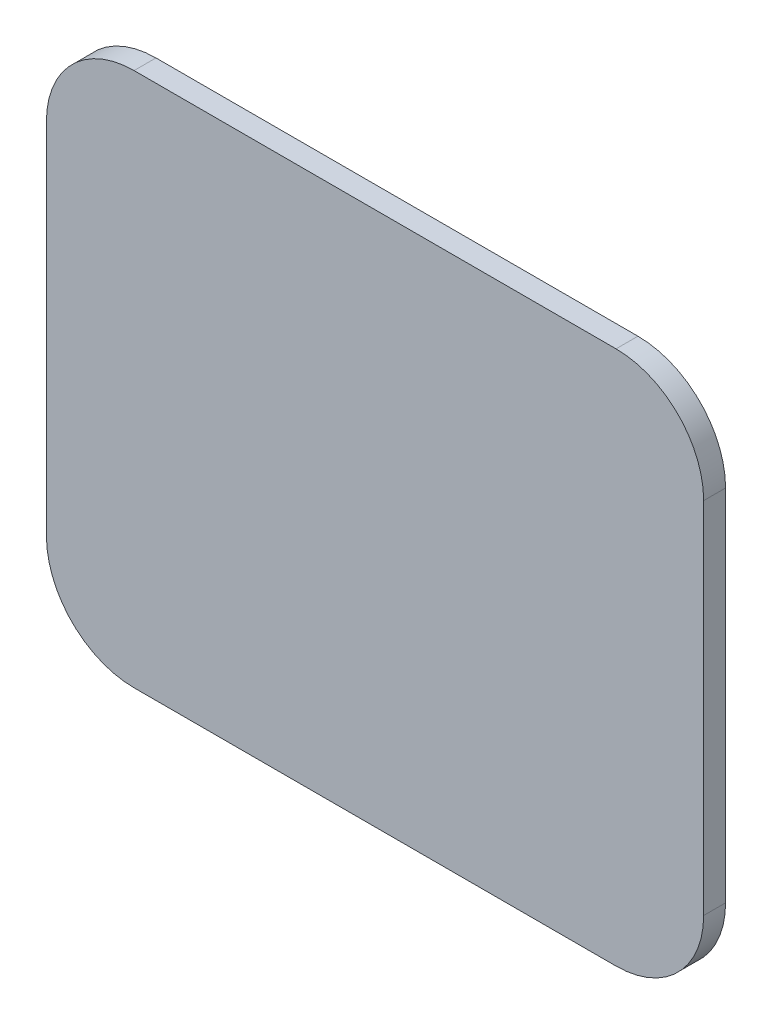
ISO-10303-21;
HEADER;
FILE_DESCRIPTION(('STEP AP214'),'2;1');
FILE_NAME('part.step','',(''),(''),'','','');
FILE_SCHEMA(('AUTOMOTIVE_DESIGN { 1 0 10303 214 1 1 1 1 }'));
ENDSEC;
DATA;
#1=APPLICATION_CONTEXT('core data for automotive mechanical design processes');
#2=APPLICATION_PROTOCOL_DEFINITION('international standard','automotive_design',2000,#1);
#3=PRODUCT_CONTEXT('',#1,'mechanical');
#4=PRODUCT('Part','Part','',(#3));
#5=PRODUCT_RELATED_PRODUCT_CATEGORY('part','',(#4));
#6=PRODUCT_DEFINITION_FORMATION('','',#4);
#7=PRODUCT_DEFINITION_CONTEXT('part definition',#1,'design');
#8=PRODUCT_DEFINITION('design','',#6,#7);
#9=PRODUCT_DEFINITION_SHAPE('','',#8);
#10=(LENGTH_UNIT() NAMED_UNIT(*) SI_UNIT(.MILLI.,.METRE.));
#11=(NAMED_UNIT(*) PLANE_ANGLE_UNIT() SI_UNIT($,.RADIAN.));
#12=(NAMED_UNIT(*) SI_UNIT($,.STERADIAN.) SOLID_ANGLE_UNIT());
#13=UNCERTAINTY_MEASURE_WITH_UNIT(LENGTH_MEASURE(1.E-05),#10,'distance_accuracy_value','');
#14=(GEOMETRIC_REPRESENTATION_CONTEXT(3) GLOBAL_UNCERTAINTY_ASSIGNED_CONTEXT((#13)) GLOBAL_UNIT_ASSIGNED_CONTEXT((#10,
#11,#12)) REPRESENTATION_CONTEXT('',''));
#15=CARTESIAN_POINT('',(0.,0.,0.));
#16=DIRECTION('',(0.,0.,1.));
#17=DIRECTION('',(1.,0.,0.));
#18=AXIS2_PLACEMENT_3D('',#15,#16,#17);
#19=CARTESIAN_POINT('',(55.,41.,5.));
#20=DIRECTION('',(0.,0.,-1.));
#21=DIRECTION('',(-1.,0.,0.));
#22=AXIS2_PLACEMENT_3D('',#19,#20,#21);
#23=CYLINDRICAL_SURFACE('',#22,20.);
#24=CARTESIAN_POINT('',(55.,41.,0.));
#25=DIRECTION('',(0.,0.,1.));
#26=DIRECTION('',(-1.,0.,0.));
#27=AXIS2_PLACEMENT_3D('',#24,#25,#26);
#28=CIRCLE('',#27,20.);
#29=CARTESIAN_POINT('',(75.,41.,0.));
#30=VERTEX_POINT('',#29);
#31=CARTESIAN_POINT('',(55.,61.,0.));
#32=VERTEX_POINT('',#31);
#33=EDGE_CURVE('E146',#30,#32,#28,.T.);
#34=ORIENTED_EDGE('',*,*,#33,.T.);
#35=DIRECTION('',(0.,0.,-1.));
#36=VECTOR('',#35,1.);
#37=CARTESIAN_POINT('',(55.,61.,5.));
#38=LINE('',#37,#36);
#39=CARTESIAN_POINT('',(55.,61.,5.));
#40=VERTEX_POINT('',#39);
#41=EDGE_CURVE('E11',#40,#32,#38,.T.);
#42=ORIENTED_EDGE('',*,*,#41,.F.);
#43=CARTESIAN_POINT('',(55.,41.,5.));
#44=DIRECTION('',(0.,0.,1.));
#45=DIRECTION('',(-1.,0.,0.));
#46=AXIS2_PLACEMENT_3D('',#43,#44,#45);
#47=CIRCLE('',#46,20.);
#48=CARTESIAN_POINT('',(75.,41.,5.));
#49=VERTEX_POINT('',#48);
#50=EDGE_CURVE('E168',#49,#40,#47,.T.);
#51=ORIENTED_EDGE('',*,*,#50,.F.);
#52=DIRECTION('',(0.,0.,-1.));
#53=VECTOR('',#52,1.);
#54=CARTESIAN_POINT('',(75.,41.,5.));
#55=LINE('',#54,#53);
#56=EDGE_CURVE('E142',#49,#30,#55,.T.);
#57=ORIENTED_EDGE('',*,*,#56,.T.);
#58=EDGE_LOOP('',(#34,#42,#51,#57));
#59=FACE_BOUND('',#58,.T.);
#60=ADVANCED_FACE('F45',(#59),#23,.T.);
#61=CARTESIAN_POINT('',(-55.,61.,5.));
#62=DIRECTION('',(0.,-1.,0.));
#63=DIRECTION('',(0.,0.,-1.));
#64=AXIS2_PLACEMENT_3D('',#61,#62,#63);
#65=PLANE('',#64);
#66=DIRECTION('',(-1.,0.,0.));
#67=VECTOR('',#66,1.);
#68=CARTESIAN_POINT('',(-55.,61.,0.));
#69=LINE('',#68,#67);
#70=CARTESIAN_POINT('',(-55.,61.,0.));
#71=VERTEX_POINT('',#70);
#72=EDGE_CURVE('E150',#32,#71,#69,.T.);
#73=ORIENTED_EDGE('',*,*,#72,.T.);
#74=DIRECTION('',(0.,0.,-1.));
#75=VECTOR('',#74,1.);
#76=CARTESIAN_POINT('',(-55.,61.,5.));
#77=LINE('',#76,#75);
#78=CARTESIAN_POINT('',(-55.,61.,5.));
#79=VERTEX_POINT('',#78);
#80=EDGE_CURVE('E54',#79,#71,#77,.T.);
#81=ORIENTED_EDGE('',*,*,#80,.F.);
#82=DIRECTION('',(-1.,0.,0.));
#83=VECTOR('',#82,1.);
#84=CARTESIAN_POINT('',(-55.,61.,5.));
#85=LINE('',#84,#83);
#86=EDGE_CURVE('E105',#40,#79,#85,.T.);
#87=ORIENTED_EDGE('',*,*,#86,.F.);
#88=ORIENTED_EDGE('',*,*,#41,.T.);
#89=EDGE_LOOP('',(#73,#81,#87,#88));
#90=FACE_BOUND('',#89,.T.);
#91=ADVANCED_FACE('F214',(#90),#65,.F.);
#92=CARTESIAN_POINT('',(-55.,41.,5.));
#93=DIRECTION('',(0.,0.,-1.));
#94=DIRECTION('',(-1.,0.,0.));
#95=AXIS2_PLACEMENT_3D('',#92,#93,#94);
#96=CYLINDRICAL_SURFACE('',#95,20.);
#97=CARTESIAN_POINT('',(-55.,41.,0.));
#98=DIRECTION('',(0.,0.,1.));
#99=DIRECTION('',(-1.,0.,0.));
#100=AXIS2_PLACEMENT_3D('',#97,#98,#99);
#101=CIRCLE('',#100,20.);
#102=CARTESIAN_POINT('',(-75.,41.,0.));
#103=VERTEX_POINT('',#102);
#104=EDGE_CURVE('E153',#71,#103,#101,.T.);
#105=ORIENTED_EDGE('',*,*,#104,.T.);
#106=DIRECTION('',(0.,0.,-1.));
#107=VECTOR('',#106,1.);
#108=CARTESIAN_POINT('',(-75.,41.,5.));
#109=LINE('',#108,#107);
#110=CARTESIAN_POINT('',(-75.,41.,5.));
#111=VERTEX_POINT('',#110);
#112=EDGE_CURVE('E179',#111,#103,#109,.T.);
#113=ORIENTED_EDGE('',*,*,#112,.F.);
#114=CARTESIAN_POINT('',(-55.,41.,5.));
#115=DIRECTION('',(0.,0.,1.));
#116=DIRECTION('',(-1.,0.,0.));
#117=AXIS2_PLACEMENT_3D('',#114,#115,#116);
#118=CIRCLE('',#117,20.);
#119=EDGE_CURVE('E189',#79,#111,#118,.T.);
#120=ORIENTED_EDGE('',*,*,#119,.F.);
#121=ORIENTED_EDGE('',*,*,#80,.T.);
#122=EDGE_LOOP('',(#105,#113,#120,#121));
#123=FACE_BOUND('',#122,.T.);
#124=ADVANCED_FACE('F187',(#123),#96,.T.);
#125=CARTESIAN_POINT('',(-75.,-41.,5.));
#126=DIRECTION('',(1.,0.,0.));
#127=DIRECTION('',(0.,0.,-1.));
#128=AXIS2_PLACEMENT_3D('',#125,#126,#127);
#129=PLANE('',#128);
#130=DIRECTION('',(0.,-1.,0.));
#131=VECTOR('',#130,1.);
#132=CARTESIAN_POINT('',(-75.,-41.,0.));
#133=LINE('',#132,#131);
#134=CARTESIAN_POINT('',(-75.,-41.,0.));
#135=VERTEX_POINT('',#134);
#136=EDGE_CURVE('E156',#103,#135,#133,.T.);
#137=ORIENTED_EDGE('',*,*,#136,.T.);
#138=DIRECTION('',(0.,0.,-1.));
#139=VECTOR('',#138,1.);
#140=CARTESIAN_POINT('',(-75.,-41.,5.));
#141=LINE('',#140,#139);
#142=CARTESIAN_POINT('',(-75.,-41.,5.));
#143=VERTEX_POINT('',#142);
#144=EDGE_CURVE('E175',#143,#135,#141,.T.);
#145=ORIENTED_EDGE('',*,*,#144,.F.);
#146=DIRECTION('',(0.,-1.,0.));
#147=VECTOR('',#146,1.);
#148=CARTESIAN_POINT('',(-75.,-41.,5.));
#149=LINE('',#148,#147);
#150=EDGE_CURVE('E202',#111,#143,#149,.T.);
#151=ORIENTED_EDGE('',*,*,#150,.F.);
#152=ORIENTED_EDGE('',*,*,#112,.T.);
#153=EDGE_LOOP('',(#137,#145,#151,#152));
#154=FACE_BOUND('',#153,.T.);
#155=ADVANCED_FACE('F197',(#154),#129,.F.);
#156=CARTESIAN_POINT('',(-55.,-41.,5.));
#157=DIRECTION('',(0.,0.,-1.));
#158=DIRECTION('',(-1.,0.,0.));
#159=AXIS2_PLACEMENT_3D('',#156,#157,#158);
#160=CYLINDRICAL_SURFACE('',#159,20.);
#161=CARTESIAN_POINT('',(-55.,-41.,0.));
#162=DIRECTION('',(0.,0.,1.));
#163=DIRECTION('',(-1.,0.,0.));
#164=AXIS2_PLACEMENT_3D('',#161,#162,#163);
#165=CIRCLE('',#164,20.);
#166=CARTESIAN_POINT('',(-55.,-61.,0.));
#167=VERTEX_POINT('',#166);
#168=EDGE_CURVE('E159',#135,#167,#165,.T.);
#169=ORIENTED_EDGE('',*,*,#168,.T.);
#170=DIRECTION('',(0.,0.,-1.));
#171=VECTOR('',#170,1.);
#172=CARTESIAN_POINT('',(-55.,-61.,5.));
#173=LINE('',#172,#171);
#174=CARTESIAN_POINT('',(-55.,-61.,5.));
#175=VERTEX_POINT('',#174);
#176=EDGE_CURVE('E135',#175,#167,#173,.T.);
#177=ORIENTED_EDGE('',*,*,#176,.F.);
#178=CARTESIAN_POINT('',(-55.,-41.,5.));
#179=DIRECTION('',(0.,0.,1.));
#180=DIRECTION('',(-1.,0.,0.));
#181=AXIS2_PLACEMENT_3D('',#178,#179,#180);
#182=CIRCLE('',#181,20.);
#183=EDGE_CURVE('E124',#143,#175,#182,.T.);
#184=ORIENTED_EDGE('',*,*,#183,.F.);
#185=ORIENTED_EDGE('',*,*,#144,.T.);
#186=EDGE_LOOP('',(#169,#177,#184,#185));
#187=FACE_BOUND('',#186,.T.);
#188=ADVANCED_FACE('F200',(#187),#160,.T.);
#189=CARTESIAN_POINT('',(-55.,-61.,5.));
#190=DIRECTION('',(0.,1.,0.));
#191=DIRECTION('',(0.,0.,1.));
#192=AXIS2_PLACEMENT_3D('',#189,#190,#191);
#193=PLANE('',#192);
#194=DIRECTION('',(1.,0.,0.));
#195=VECTOR('',#194,1.);
#196=CARTESIAN_POINT('',(-55.,-61.,0.));
#197=LINE('',#196,#195);
#198=CARTESIAN_POINT('',(55.,-61.,0.));
#199=VERTEX_POINT('',#198);
#200=EDGE_CURVE('E133',#167,#199,#197,.T.);
#201=ORIENTED_EDGE('',*,*,#200,.T.);
#202=DIRECTION('',(0.,0.,-1.));
#203=VECTOR('',#202,1.);
#204=CARTESIAN_POINT('',(55.,-61.,5.));
#205=LINE('',#204,#203);
#206=CARTESIAN_POINT('',(55.,-61.,5.));
#207=VERTEX_POINT('',#206);
#208=EDGE_CURVE('E130',#207,#199,#205,.T.);
#209=ORIENTED_EDGE('',*,*,#208,.F.);
#210=DIRECTION('',(1.,0.,0.));
#211=VECTOR('',#210,1.);
#212=CARTESIAN_POINT('',(-55.,-61.,5.));
#213=LINE('',#212,#211);
#214=EDGE_CURVE('E118',#175,#207,#213,.T.);
#215=ORIENTED_EDGE('',*,*,#214,.F.);
#216=ORIENTED_EDGE('',*,*,#176,.T.);
#217=EDGE_LOOP('',(#201,#209,#215,#216));
#218=FACE_BOUND('',#217,.T.);
#219=ADVANCED_FACE('F131',(#218),#193,.F.);
#220=CARTESIAN_POINT('',(55.,-41.,5.));
#221=DIRECTION('',(0.,0.,-1.));
#222=DIRECTION('',(-1.,0.,0.));
#223=AXIS2_PLACEMENT_3D('',#220,#221,#222);
#224=CYLINDRICAL_SURFACE('',#223,20.);
#225=CARTESIAN_POINT('',(55.,-41.,0.));
#226=DIRECTION('',(0.,0.,1.));
#227=DIRECTION('',(1.,0.,0.));
#228=AXIS2_PLACEMENT_3D('',#225,#226,#227);
#229=CIRCLE('',#228,20.);
#230=CARTESIAN_POINT('',(75.,-41.,0.));
#231=VERTEX_POINT('',#230);
#232=EDGE_CURVE('E91',#199,#231,#229,.T.);
#233=ORIENTED_EDGE('',*,*,#232,.T.);
#234=DIRECTION('',(0.,0.,-1.));
#235=VECTOR('',#234,1.);
#236=CARTESIAN_POINT('',(75.,-41.,5.));
#237=LINE('',#236,#235);
#238=CARTESIAN_POINT('',(75.,-41.,5.));
#239=VERTEX_POINT('',#238);
#240=EDGE_CURVE('E136',#239,#231,#237,.T.);
#241=ORIENTED_EDGE('',*,*,#240,.F.);
#242=CARTESIAN_POINT('',(55.,-41.,5.));
#243=DIRECTION('',(0.,0.,1.));
#244=DIRECTION('',(1.,0.,0.));
#245=AXIS2_PLACEMENT_3D('',#242,#243,#244);
#246=CIRCLE('',#245,20.);
#247=EDGE_CURVE('E122',#207,#239,#246,.T.);
#248=ORIENTED_EDGE('',*,*,#247,.F.);
#249=ORIENTED_EDGE('',*,*,#208,.T.);
#250=EDGE_LOOP('',(#233,#241,#248,#249));
#251=FACE_BOUND('',#250,.T.);
#252=ADVANCED_FACE('F138',(#251),#224,.T.);
#253=CARTESIAN_POINT('',(75.,-41.,5.));
#254=DIRECTION('',(-1.,0.,0.));
#255=DIRECTION('',(0.,0.,1.));
#256=AXIS2_PLACEMENT_3D('',#253,#254,#255);
#257=PLANE('',#256);
#258=DIRECTION('',(0.,1.,0.));
#259=VECTOR('',#258,1.);
#260=CARTESIAN_POINT('',(75.,-41.,0.));
#261=LINE('',#260,#259);
#262=EDGE_CURVE('E97',#231,#30,#261,.T.);
#263=ORIENTED_EDGE('',*,*,#262,.T.);
#264=ORIENTED_EDGE('',*,*,#56,.F.);
#265=DIRECTION('',(0.,1.,0.));
#266=VECTOR('',#265,1.);
#267=CARTESIAN_POINT('',(75.,-41.,5.));
#268=LINE('',#267,#266);
#269=EDGE_CURVE('E62',#239,#49,#268,.T.);
#270=ORIENTED_EDGE('',*,*,#269,.F.);
#271=ORIENTED_EDGE('',*,*,#240,.T.);
#272=EDGE_LOOP('',(#263,#264,#270,#271));
#273=FACE_BOUND('',#272,.T.);
#274=ADVANCED_FACE('F230',(#273),#257,.F.);
#275=CARTESIAN_POINT('',(55.,41.,5.));
#276=DIRECTION('',(0.,0.,-1.));
#277=DIRECTION('',(-1.,0.,0.));
#278=AXIS2_PLACEMENT_3D('',#275,#276,#277);
#279=PLANE('',#278);
#280=ORIENTED_EDGE('',*,*,#50,.T.);
#281=ORIENTED_EDGE('',*,*,#86,.T.);
#282=ORIENTED_EDGE('',*,*,#119,.T.);
#283=ORIENTED_EDGE('',*,*,#150,.T.);
#284=ORIENTED_EDGE('',*,*,#183,.T.);
#285=ORIENTED_EDGE('',*,*,#214,.T.);
#286=ORIENTED_EDGE('',*,*,#247,.T.);
#287=ORIENTED_EDGE('',*,*,#269,.T.);
#288=EDGE_LOOP('',(#280,#281,#282,#283,#284,#285,#286,#287));
#289=FACE_BOUND('',#288,.T.);
#290=ADVANCED_FACE('F120',(#289),#279,.F.);
#291=CARTESIAN_POINT('',(55.,41.,0.));
#292=DIRECTION('',(0.,0.,-1.));
#293=DIRECTION('',(-1.,0.,0.));
#294=AXIS2_PLACEMENT_3D('',#291,#292,#293);
#295=PLANE('',#294);
#296=ORIENTED_EDGE('',*,*,#33,.F.);
#297=ORIENTED_EDGE('',*,*,#262,.F.);
#298=ORIENTED_EDGE('',*,*,#232,.F.);
#299=ORIENTED_EDGE('',*,*,#200,.F.);
#300=ORIENTED_EDGE('',*,*,#168,.F.);
#301=ORIENTED_EDGE('',*,*,#136,.F.);
#302=ORIENTED_EDGE('',*,*,#104,.F.);
#303=ORIENTED_EDGE('',*,*,#72,.F.);
#304=EDGE_LOOP('',(#296,#297,#298,#299,#300,#301,#302,#303));
#305=FACE_BOUND('',#304,.T.);
#306=ADVANCED_FACE('F193',(#305),#295,.T.);
#307=CLOSED_SHELL('',(#60,#91,#124,#155,#188,#219,#252,#274,#290,#306));
#308=MANIFOLD_SOLID_BREP('B2',#307);
#309=ADVANCED_BREP_SHAPE_REPRESENTATION('',(#18,#308),#14);
#310=SHAPE_DEFINITION_REPRESENTATION(#9,#309);
ENDSEC;
END-ISO-10303-21;
